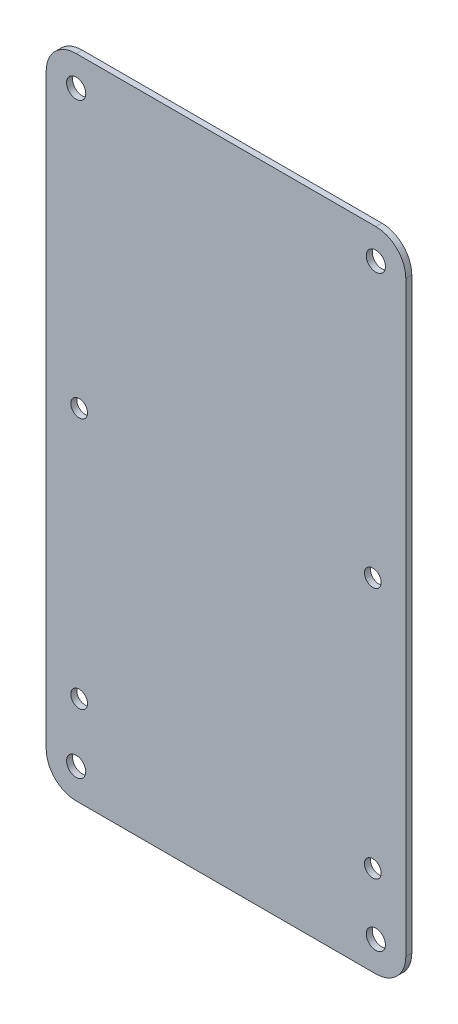
ISO-10303-21;
HEADER;
FILE_DESCRIPTION(('STEP AP214'),'2;1');
FILE_NAME('part.step','',(''),(''),'','','');
FILE_SCHEMA(('AUTOMOTIVE_DESIGN { 1 0 10303 214 1 1 1 1 }'));
ENDSEC;
DATA;
#1=APPLICATION_CONTEXT('core data for automotive mechanical design processes');
#2=APPLICATION_PROTOCOL_DEFINITION('international standard','automotive_design',2000,#1);
#3=PRODUCT_CONTEXT('',#1,'mechanical');
#4=PRODUCT('Part','Part','',(#3));
#5=PRODUCT_RELATED_PRODUCT_CATEGORY('part','',(#4));
#6=PRODUCT_DEFINITION_FORMATION('','',#4);
#7=PRODUCT_DEFINITION_CONTEXT('part definition',#1,'design');
#8=PRODUCT_DEFINITION('design','',#6,#7);
#9=PRODUCT_DEFINITION_SHAPE('','',#8);
#10=(LENGTH_UNIT() NAMED_UNIT(*) SI_UNIT(.MILLI.,.METRE.));
#11=(NAMED_UNIT(*) PLANE_ANGLE_UNIT() SI_UNIT($,.RADIAN.));
#12=(NAMED_UNIT(*) SI_UNIT($,.STERADIAN.) SOLID_ANGLE_UNIT());
#13=UNCERTAINTY_MEASURE_WITH_UNIT(LENGTH_MEASURE(1.E-05),#10,'distance_accuracy_value','');
#14=(GEOMETRIC_REPRESENTATION_CONTEXT(3) GLOBAL_UNCERTAINTY_ASSIGNED_CONTEXT((#13)) GLOBAL_UNIT_ASSIGNED_CONTEXT((#10,
#11,#12)) REPRESENTATION_CONTEXT('',''));
#15=CARTESIAN_POINT('',(0.,0.,0.));
#16=DIRECTION('',(0.,0.,1.));
#17=DIRECTION('',(1.,0.,0.));
#18=AXIS2_PLACEMENT_3D('',#15,#16,#17);
#19=CARTESIAN_POINT('',(30.,54.,1.));
#20=DIRECTION('',(-1.,0.,0.));
#21=DIRECTION('',(0.,-1.,0.));
#22=AXIS2_PLACEMENT_3D('',#19,#20,#21);
#23=PLANE('',#22);
#24=DIRECTION('',(0.,1.,0.));
#25=VECTOR('',#24,1.);
#26=CARTESIAN_POINT('',(30.,54.,1.));
#27=LINE('',#26,#25);
#28=CARTESIAN_POINT('',(30.,-49.,1.));
#29=VERTEX_POINT('',#28);
#30=CARTESIAN_POINT('',(30.,49.,1.));
#31=VERTEX_POINT('',#30);
#32=EDGE_CURVE('E128',#29,#31,#27,.T.);
#33=ORIENTED_EDGE('',*,*,#32,.F.);
#34=DIRECTION('',(0.,0.,-1.));
#35=VECTOR('',#34,1.);
#36=CARTESIAN_POINT('',(30.,-49.,1.));
#37=LINE('',#36,#35);
#38=CARTESIAN_POINT('',(30.,-49.,0.));
#39=VERTEX_POINT('',#38);
#40=EDGE_CURVE('E169',#29,#39,#37,.T.);
#41=ORIENTED_EDGE('',*,*,#40,.T.);
#42=DIRECTION('',(0.,1.,0.));
#43=VECTOR('',#42,1.);
#44=CARTESIAN_POINT('',(30.,54.,0.));
#45=LINE('',#44,#43);
#46=CARTESIAN_POINT('',(30.,49.,0.));
#47=VERTEX_POINT('',#46);
#48=EDGE_CURVE('E140',#39,#47,#45,.T.);
#49=ORIENTED_EDGE('',*,*,#48,.T.);
#50=DIRECTION('',(0.,0.,-1.));
#51=VECTOR('',#50,1.);
#52=CARTESIAN_POINT('',(30.,49.,1.));
#53=LINE('',#52,#51);
#54=EDGE_CURVE('E167',#47,#31,#53,.F.);
#55=ORIENTED_EDGE('',*,*,#54,.T.);
#56=EDGE_LOOP('',(#33,#41,#49,#55));
#57=FACE_BOUND('',#56,.T.);
#58=ADVANCED_FACE('F37',(#57),#23,.F.);
#59=CARTESIAN_POINT('',(-30.,54.,1.));
#60=DIRECTION('',(0.,-1.,0.));
#61=DIRECTION('',(1.,0.,0.));
#62=AXIS2_PLACEMENT_3D('',#59,#60,#61);
#63=PLANE('',#62);
#64=DIRECTION('',(-1.,0.,0.));
#65=VECTOR('',#64,1.);
#66=CARTESIAN_POINT('',(-30.,54.,0.));
#67=LINE('',#66,#65);
#68=CARTESIAN_POINT('',(25.,54.,0.));
#69=VERTEX_POINT('',#68);
#70=CARTESIAN_POINT('',(-25.,54.,0.));
#71=VERTEX_POINT('',#70);
#72=EDGE_CURVE('E133',#69,#71,#67,.T.);
#73=ORIENTED_EDGE('',*,*,#72,.T.);
#74=DIRECTION('',(0.,0.,-1.));
#75=VECTOR('',#74,1.);
#76=CARTESIAN_POINT('',(-25.,54.,1.));
#77=LINE('',#76,#75);
#78=CARTESIAN_POINT('',(-25.,54.,1.));
#79=VERTEX_POINT('',#78);
#80=EDGE_CURVE('E11',#71,#79,#77,.F.);
#81=ORIENTED_EDGE('',*,*,#80,.T.);
#82=DIRECTION('',(-1.,0.,0.));
#83=VECTOR('',#82,1.);
#84=CARTESIAN_POINT('',(-30.,54.,1.));
#85=LINE('',#84,#83);
#86=CARTESIAN_POINT('',(25.,54.,1.));
#87=VERTEX_POINT('',#86);
#88=EDGE_CURVE('E131',#87,#79,#85,.T.);
#89=ORIENTED_EDGE('',*,*,#88,.F.);
#90=DIRECTION('',(0.,0.,-1.));
#91=VECTOR('',#90,1.);
#92=CARTESIAN_POINT('',(25.,54.,1.));
#93=LINE('',#92,#91);
#94=EDGE_CURVE('E45',#87,#69,#93,.T.);
#95=ORIENTED_EDGE('',*,*,#94,.T.);
#96=EDGE_LOOP('',(#73,#81,#89,#95));
#97=FACE_BOUND('',#96,.T.);
#98=ADVANCED_FACE('F174',(#97),#63,.F.);
#99=CARTESIAN_POINT('',(-30.,54.,1.));
#100=DIRECTION('',(1.,0.,0.));
#101=DIRECTION('',(0.,1.,0.));
#102=AXIS2_PLACEMENT_3D('',#99,#100,#101);
#103=PLANE('',#102);
#104=DIRECTION('',(0.,-1.,0.));
#105=VECTOR('',#104,1.);
#106=CARTESIAN_POINT('',(-30.,54.,0.));
#107=LINE('',#106,#105);
#108=CARTESIAN_POINT('',(-30.,49.,0.));
#109=VERTEX_POINT('',#108);
#110=CARTESIAN_POINT('',(-30.,-49.,0.));
#111=VERTEX_POINT('',#110);
#112=EDGE_CURVE('E129',#109,#111,#107,.T.);
#113=ORIENTED_EDGE('',*,*,#112,.T.);
#114=DIRECTION('',(0.,0.,-1.));
#115=VECTOR('',#114,1.);
#116=CARTESIAN_POINT('',(-30.,-49.,1.));
#117=LINE('',#116,#115);
#118=CARTESIAN_POINT('',(-30.,-49.,1.));
#119=VERTEX_POINT('',#118);
#120=EDGE_CURVE('E107',#111,#119,#117,.F.);
#121=ORIENTED_EDGE('',*,*,#120,.T.);
#122=DIRECTION('',(0.,-1.,0.));
#123=VECTOR('',#122,1.);
#124=CARTESIAN_POINT('',(-30.,54.,1.));
#125=LINE('',#124,#123);
#126=CARTESIAN_POINT('',(-30.,49.,1.));
#127=VERTEX_POINT('',#126);
#128=EDGE_CURVE('E180',#127,#119,#125,.T.);
#129=ORIENTED_EDGE('',*,*,#128,.F.);
#130=DIRECTION('',(0.,0.,-1.));
#131=VECTOR('',#130,1.);
#132=CARTESIAN_POINT('',(-30.,49.,1.));
#133=LINE('',#132,#131);
#134=EDGE_CURVE('E112',#127,#109,#133,.T.);
#135=ORIENTED_EDGE('',*,*,#134,.T.);
#136=EDGE_LOOP('',(#113,#121,#129,#135));
#137=FACE_BOUND('',#136,.T.);
#138=ADVANCED_FACE('F249',(#137),#103,.F.);
#139=CARTESIAN_POINT('',(-30.,-54.,1.));
#140=DIRECTION('',(0.,1.,0.));
#141=DIRECTION('',(0.,0.,1.));
#142=AXIS2_PLACEMENT_3D('',#139,#140,#141);
#143=PLANE('',#142);
#144=DIRECTION('',(1.,0.,0.));
#145=VECTOR('',#144,1.);
#146=CARTESIAN_POINT('',(-30.,-54.,1.));
#147=LINE('',#146,#145);
#148=CARTESIAN_POINT('',(-25.,-54.,1.));
#149=VERTEX_POINT('',#148);
#150=CARTESIAN_POINT('',(25.,-54.,1.));
#151=VERTEX_POINT('',#150);
#152=EDGE_CURVE('E122',#149,#151,#147,.T.);
#153=ORIENTED_EDGE('',*,*,#152,.F.);
#154=DIRECTION('',(0.,0.,-1.));
#155=VECTOR('',#154,1.);
#156=CARTESIAN_POINT('',(-25.,-54.,1.));
#157=LINE('',#156,#155);
#158=CARTESIAN_POINT('',(-25.,-54.,0.));
#159=VERTEX_POINT('',#158);
#160=EDGE_CURVE('E106',#149,#159,#157,.T.);
#161=ORIENTED_EDGE('',*,*,#160,.T.);
#162=DIRECTION('',(1.,0.,0.));
#163=VECTOR('',#162,1.);
#164=CARTESIAN_POINT('',(-30.,-54.,0.));
#165=LINE('',#164,#163);
#166=CARTESIAN_POINT('',(25.,-54.,0.));
#167=VERTEX_POINT('',#166);
#168=EDGE_CURVE('E119',#159,#167,#165,.T.);
#169=ORIENTED_EDGE('',*,*,#168,.T.);
#170=DIRECTION('',(0.,0.,-1.));
#171=VECTOR('',#170,1.);
#172=CARTESIAN_POINT('',(25.,-54.,1.));
#173=LINE('',#172,#171);
#174=EDGE_CURVE('E124',#167,#151,#173,.F.);
#175=ORIENTED_EDGE('',*,*,#174,.T.);
#176=EDGE_LOOP('',(#153,#161,#169,#175));
#177=FACE_BOUND('',#176,.T.);
#178=ADVANCED_FACE('F118',(#177),#143,.F.);
#179=CARTESIAN_POINT('',(0.,0.,1.));
#180=DIRECTION('',(0.,0.,1.));
#181=DIRECTION('',(1.,0.,0.));
#182=AXIS2_PLACEMENT_3D('',#179,#180,#181);
#183=PLANE('',#182);
#184=CARTESIAN_POINT('',(-25.,49.,1.));
#185=DIRECTION('',(0.,0.,1.));
#186=DIRECTION('',(1.,0.,0.));
#187=AXIS2_PLACEMENT_3D('',#184,#185,#186);
#188=CIRCLE('',#187,1.6);
#189=CARTESIAN_POINT('',(-23.4,49.,1.));
#190=VERTEX_POINT('',#189);
#191=EDGE_CURVE('E213',#190,#190,#188,.T.);
#192=ORIENTED_EDGE('',*,*,#191,.F.);
#193=EDGE_LOOP('',(#192));
#194=FACE_BOUND('',#193,.T.);
#195=CARTESIAN_POINT('',(-25.,-49.,1.));
#196=DIRECTION('',(0.,0.,1.));
#197=DIRECTION('',(1.,0.,0.));
#198=AXIS2_PLACEMENT_3D('',#195,#196,#197);
#199=CIRCLE('',#198,1.6);
#200=CARTESIAN_POINT('',(-23.4,-49.,1.));
#201=VERTEX_POINT('',#200);
#202=EDGE_CURVE('E207',#201,#201,#199,.T.);
#203=ORIENTED_EDGE('',*,*,#202,.F.);
#204=EDGE_LOOP('',(#203));
#205=FACE_BOUND('',#204,.T.);
#206=CARTESIAN_POINT('',(25.,-49.,1.));
#207=DIRECTION('',(0.,0.,1.));
#208=DIRECTION('',(1.,0.,0.));
#209=AXIS2_PLACEMENT_3D('',#206,#207,#208);
#210=CIRCLE('',#209,1.6);
#211=CARTESIAN_POINT('',(26.6,-49.,1.));
#212=VERTEX_POINT('',#211);
#213=EDGE_CURVE('E201',#212,#212,#210,.T.);
#214=ORIENTED_EDGE('',*,*,#213,.F.);
#215=EDGE_LOOP('',(#214));
#216=FACE_BOUND('',#215,.T.);
#217=CARTESIAN_POINT('',(25.,49.,1.));
#218=DIRECTION('',(0.,0.,1.));
#219=DIRECTION('',(1.,0.,0.));
#220=AXIS2_PLACEMENT_3D('',#217,#218,#219);
#221=CIRCLE('',#220,1.6);
#222=CARTESIAN_POINT('',(26.6,49.,1.));
#223=VERTEX_POINT('',#222);
#224=EDGE_CURVE('E195',#223,#223,#221,.T.);
#225=ORIENTED_EDGE('',*,*,#224,.F.);
#226=EDGE_LOOP('',(#225));
#227=FACE_BOUND('',#226,.T.);
#228=CARTESIAN_POINT('',(-24.5,-39.,1.));
#229=DIRECTION('',(0.,0.,1.));
#230=DIRECTION('',(1.,0.,0.));
#231=AXIS2_PLACEMENT_3D('',#228,#229,#230);
#232=CIRCLE('',#231,1.4);
#233=CARTESIAN_POINT('',(-23.1,-39.,1.));
#234=VERTEX_POINT('',#233);
#235=EDGE_CURVE('E146',#234,#234,#232,.T.);
#236=ORIENTED_EDGE('',*,*,#235,.F.);
#237=EDGE_LOOP('',(#236));
#238=FACE_BOUND('',#237,.T.);
#239=CARTESIAN_POINT('',(24.5,3.00000000000001,1.));
#240=DIRECTION('',(0.,0.,1.));
#241=DIRECTION('',(1.,0.,0.));
#242=AXIS2_PLACEMENT_3D('',#239,#240,#241);
#243=CIRCLE('',#242,1.4);
#244=CARTESIAN_POINT('',(25.9,3.00000000000001,1.));
#245=VERTEX_POINT('',#244);
#246=EDGE_CURVE('E189',#245,#245,#243,.T.);
#247=ORIENTED_EDGE('',*,*,#246,.F.);
#248=EDGE_LOOP('',(#247));
#249=FACE_BOUND('',#248,.T.);
#250=CARTESIAN_POINT('',(24.5,-39.,1.));
#251=DIRECTION('',(0.,0.,1.));
#252=DIRECTION('',(1.,0.,0.));
#253=AXIS2_PLACEMENT_3D('',#250,#251,#252);
#254=CIRCLE('',#253,1.4);
#255=CARTESIAN_POINT('',(25.9,-39.,1.));
#256=VERTEX_POINT('',#255);
#257=EDGE_CURVE('E186',#256,#256,#254,.T.);
#258=ORIENTED_EDGE('',*,*,#257,.F.);
#259=EDGE_LOOP('',(#258));
#260=FACE_BOUND('',#259,.T.);
#261=CARTESIAN_POINT('',(-24.5,3.,1.));
#262=DIRECTION('',(0.,0.,1.));
#263=DIRECTION('',(1.,0.,0.));
#264=AXIS2_PLACEMENT_3D('',#261,#262,#263);
#265=CIRCLE('',#264,1.4);
#266=CARTESIAN_POINT('',(-23.1,3.,1.));
#267=VERTEX_POINT('',#266);
#268=EDGE_CURVE('E141',#267,#267,#265,.T.);
#269=ORIENTED_EDGE('',*,*,#268,.F.);
#270=EDGE_LOOP('',(#269));
#271=FACE_BOUND('',#270,.T.);
#272=ORIENTED_EDGE('',*,*,#128,.T.);
#273=CARTESIAN_POINT('',(-25.,-49.,1.));
#274=DIRECTION('',(0.,0.,1.));
#275=DIRECTION('',(1.,0.,0.));
#276=AXIS2_PLACEMENT_3D('',#273,#274,#275);
#277=CIRCLE('',#276,5.);
#278=EDGE_CURVE('E165',#119,#149,#277,.T.);
#279=ORIENTED_EDGE('',*,*,#278,.T.);
#280=ORIENTED_EDGE('',*,*,#152,.T.);
#281=CARTESIAN_POINT('',(25.,-49.,1.));
#282=DIRECTION('',(0.,0.,1.));
#283=DIRECTION('',(1.,0.,0.));
#284=AXIS2_PLACEMENT_3D('',#281,#282,#283);
#285=CIRCLE('',#284,5.);
#286=EDGE_CURVE('E163',#151,#29,#285,.T.);
#287=ORIENTED_EDGE('',*,*,#286,.T.);
#288=ORIENTED_EDGE('',*,*,#32,.T.);
#289=CARTESIAN_POINT('',(25.,49.,1.));
#290=DIRECTION('',(0.,0.,1.));
#291=DIRECTION('',(1.,0.,0.));
#292=AXIS2_PLACEMENT_3D('',#289,#290,#291);
#293=CIRCLE('',#292,5.);
#294=EDGE_CURVE('E57',#31,#87,#293,.T.);
#295=ORIENTED_EDGE('',*,*,#294,.T.);
#296=ORIENTED_EDGE('',*,*,#88,.T.);
#297=CARTESIAN_POINT('',(-25.,49.,1.));
#298=DIRECTION('',(0.,0.,1.));
#299=DIRECTION('',(1.,0.,0.));
#300=AXIS2_PLACEMENT_3D('',#297,#298,#299);
#301=CIRCLE('',#300,5.);
#302=EDGE_CURVE('E161',#79,#127,#301,.T.);
#303=ORIENTED_EDGE('',*,*,#302,.T.);
#304=EDGE_LOOP('',(#272,#279,#280,#287,#288,#295,#296,#303));
#305=FACE_BOUND('',#304,.T.);
#306=ADVANCED_FACE('F228',(#194,#205,#216,#227,#238,#249,#260,#271,#305),#183,.T.);
#307=CARTESIAN_POINT('',(0.,0.,0.));
#308=DIRECTION('',(0.,0.,1.));
#309=DIRECTION('',(1.,0.,0.));
#310=AXIS2_PLACEMENT_3D('',#307,#308,#309);
#311=PLANE('',#310);
#312=CARTESIAN_POINT('',(-25.,49.,0.));
#313=DIRECTION('',(0.,0.,1.));
#314=DIRECTION('',(1.,0.,0.));
#315=AXIS2_PLACEMENT_3D('',#312,#313,#314);
#316=CIRCLE('',#315,1.6);
#317=CARTESIAN_POINT('',(-23.4,49.,0.));
#318=VERTEX_POINT('',#317);
#319=EDGE_CURVE('E198',#318,#318,#316,.T.);
#320=ORIENTED_EDGE('',*,*,#319,.T.);
#321=EDGE_LOOP('',(#320));
#322=FACE_BOUND('',#321,.T.);
#323=CARTESIAN_POINT('',(-25.,-49.,0.));
#324=DIRECTION('',(0.,0.,1.));
#325=DIRECTION('',(1.,0.,0.));
#326=AXIS2_PLACEMENT_3D('',#323,#324,#325);
#327=CIRCLE('',#326,1.6);
#328=CARTESIAN_POINT('',(-23.4,-49.,0.));
#329=VERTEX_POINT('',#328);
#330=EDGE_CURVE('E210',#329,#329,#327,.T.);
#331=ORIENTED_EDGE('',*,*,#330,.T.);
#332=EDGE_LOOP('',(#331));
#333=FACE_BOUND('',#332,.T.);
#334=CARTESIAN_POINT('',(25.,-49.,0.));
#335=DIRECTION('',(0.,0.,1.));
#336=DIRECTION('',(1.,0.,0.));
#337=AXIS2_PLACEMENT_3D('',#334,#335,#336);
#338=CIRCLE('',#337,1.6);
#339=CARTESIAN_POINT('',(26.6,-49.,0.));
#340=VERTEX_POINT('',#339);
#341=EDGE_CURVE('E204',#340,#340,#338,.T.);
#342=ORIENTED_EDGE('',*,*,#341,.T.);
#343=EDGE_LOOP('',(#342));
#344=FACE_BOUND('',#343,.T.);
#345=CARTESIAN_POINT('',(25.,49.,0.));
#346=DIRECTION('',(0.,0.,1.));
#347=DIRECTION('',(1.,0.,0.));
#348=AXIS2_PLACEMENT_3D('',#345,#346,#347);
#349=CIRCLE('',#348,1.6);
#350=CARTESIAN_POINT('',(26.6,49.,0.));
#351=VERTEX_POINT('',#350);
#352=EDGE_CURVE('E190',#351,#351,#349,.T.);
#353=ORIENTED_EDGE('',*,*,#352,.T.);
#354=EDGE_LOOP('',(#353));
#355=FACE_BOUND('',#354,.T.);
#356=CARTESIAN_POINT('',(-24.5,-39.,0.));
#357=DIRECTION('',(0.,0.,1.));
#358=DIRECTION('',(1.,0.,0.));
#359=AXIS2_PLACEMENT_3D('',#356,#357,#358);
#360=CIRCLE('',#359,1.4);
#361=CARTESIAN_POINT('',(-23.1,-39.,0.));
#362=VERTEX_POINT('',#361);
#363=EDGE_CURVE('E149',#362,#362,#360,.T.);
#364=ORIENTED_EDGE('',*,*,#363,.T.);
#365=EDGE_LOOP('',(#364));
#366=FACE_BOUND('',#365,.T.);
#367=CARTESIAN_POINT('',(24.5,3.00000000000001,0.));
#368=DIRECTION('',(0.,0.,1.));
#369=DIRECTION('',(1.,0.,0.));
#370=AXIS2_PLACEMENT_3D('',#367,#368,#369);
#371=CIRCLE('',#370,1.4);
#372=CARTESIAN_POINT('',(25.9,3.00000000000001,0.));
#373=VERTEX_POINT('',#372);
#374=EDGE_CURVE('E145',#373,#373,#371,.T.);
#375=ORIENTED_EDGE('',*,*,#374,.T.);
#376=EDGE_LOOP('',(#375));
#377=FACE_BOUND('',#376,.T.);
#378=CARTESIAN_POINT('',(24.5,-39.,0.));
#379=DIRECTION('',(0.,0.,1.));
#380=DIRECTION('',(1.,0.,0.));
#381=AXIS2_PLACEMENT_3D('',#378,#379,#380);
#382=CIRCLE('',#381,1.4);
#383=CARTESIAN_POINT('',(25.9,-39.,0.));
#384=VERTEX_POINT('',#383);
#385=EDGE_CURVE('E142',#384,#384,#382,.T.);
#386=ORIENTED_EDGE('',*,*,#385,.T.);
#387=EDGE_LOOP('',(#386));
#388=FACE_BOUND('',#387,.T.);
#389=CARTESIAN_POINT('',(-24.5,3.,0.));
#390=DIRECTION('',(0.,0.,1.));
#391=DIRECTION('',(1.,0.,0.));
#392=AXIS2_PLACEMENT_3D('',#389,#390,#391);
#393=CIRCLE('',#392,1.4);
#394=CARTESIAN_POINT('',(-23.1,3.,0.));
#395=VERTEX_POINT('',#394);
#396=EDGE_CURVE('E137',#395,#395,#393,.T.);
#397=ORIENTED_EDGE('',*,*,#396,.T.);
#398=EDGE_LOOP('',(#397));
#399=FACE_BOUND('',#398,.T.);
#400=ORIENTED_EDGE('',*,*,#168,.F.);
#401=CARTESIAN_POINT('',(-25.,-49.,0.));
#402=DIRECTION('',(0.,0.,1.));
#403=DIRECTION('',(1.,0.,0.));
#404=AXIS2_PLACEMENT_3D('',#401,#402,#403);
#405=CIRCLE('',#404,5.);
#406=EDGE_CURVE('E102',#159,#111,#405,.F.);
#407=ORIENTED_EDGE('',*,*,#406,.T.);
#408=ORIENTED_EDGE('',*,*,#112,.F.);
#409=CARTESIAN_POINT('',(-25.,49.,0.));
#410=DIRECTION('',(0.,0.,1.));
#411=DIRECTION('',(1.,0.,0.));
#412=AXIS2_PLACEMENT_3D('',#409,#410,#411);
#413=CIRCLE('',#412,5.);
#414=EDGE_CURVE('E154',#109,#71,#413,.F.);
#415=ORIENTED_EDGE('',*,*,#414,.T.);
#416=ORIENTED_EDGE('',*,*,#72,.F.);
#417=CARTESIAN_POINT('',(25.,49.,0.));
#418=DIRECTION('',(0.,0.,1.));
#419=DIRECTION('',(1.,0.,0.));
#420=AXIS2_PLACEMENT_3D('',#417,#418,#419);
#421=CIRCLE('',#420,5.);
#422=EDGE_CURVE('E123',#69,#47,#421,.F.);
#423=ORIENTED_EDGE('',*,*,#422,.T.);
#424=ORIENTED_EDGE('',*,*,#48,.F.);
#425=CARTESIAN_POINT('',(25.,-49.,0.));
#426=DIRECTION('',(0.,0.,1.));
#427=DIRECTION('',(1.,0.,0.));
#428=AXIS2_PLACEMENT_3D('',#425,#426,#427);
#429=CIRCLE('',#428,5.);
#430=EDGE_CURVE('E113',#39,#167,#429,.F.);
#431=ORIENTED_EDGE('',*,*,#430,.T.);
#432=EDGE_LOOP('',(#400,#407,#408,#415,#416,#423,#424,#431));
#433=FACE_BOUND('',#432,.T.);
#434=ADVANCED_FACE('F126',(#322,#333,#344,#355,#366,#377,#388,#399,#433),#311,.F.);
#435=CARTESIAN_POINT('',(-24.5,3.,-9.));
#436=DIRECTION('',(0.,0.,1.));
#437=DIRECTION('',(1.,0.,0.));
#438=AXIS2_PLACEMENT_3D('',#435,#436,#437);
#439=CYLINDRICAL_SURFACE('',#438,1.4);
#440=ORIENTED_EDGE('',*,*,#268,.T.);
#441=EDGE_LOOP('',(#440));
#442=FACE_BOUND('',#441,.T.);
#443=ORIENTED_EDGE('',*,*,#396,.F.);
#444=EDGE_LOOP('',(#443));
#445=FACE_BOUND('',#444,.T.);
#446=ADVANCED_FACE('F351',(#442,#445),#439,.F.);
#447=CARTESIAN_POINT('',(24.5,-39.,-9.));
#448=DIRECTION('',(0.,0.,1.));
#449=DIRECTION('',(1.,0.,0.));
#450=AXIS2_PLACEMENT_3D('',#447,#448,#449);
#451=CYLINDRICAL_SURFACE('',#450,1.4);
#452=ORIENTED_EDGE('',*,*,#257,.T.);
#453=EDGE_LOOP('',(#452));
#454=FACE_BOUND('',#453,.T.);
#455=ORIENTED_EDGE('',*,*,#385,.F.);
#456=EDGE_LOOP('',(#455));
#457=FACE_BOUND('',#456,.T.);
#458=ADVANCED_FACE('F342',(#454,#457),#451,.F.);
#459=CARTESIAN_POINT('',(24.5,3.00000000000001,-9.));
#460=DIRECTION('',(0.,0.,1.));
#461=DIRECTION('',(1.,0.,0.));
#462=AXIS2_PLACEMENT_3D('',#459,#460,#461);
#463=CYLINDRICAL_SURFACE('',#462,1.4);
#464=ORIENTED_EDGE('',*,*,#246,.T.);
#465=EDGE_LOOP('',(#464));
#466=FACE_BOUND('',#465,.T.);
#467=ORIENTED_EDGE('',*,*,#374,.F.);
#468=EDGE_LOOP('',(#467));
#469=FACE_BOUND('',#468,.T.);
#470=ADVANCED_FACE('F333',(#466,#469),#463,.F.);
#471=CARTESIAN_POINT('',(-24.5,-39.,-9.));
#472=DIRECTION('',(0.,0.,1.));
#473=DIRECTION('',(1.,0.,0.));
#474=AXIS2_PLACEMENT_3D('',#471,#472,#473);
#475=CYLINDRICAL_SURFACE('',#474,1.4);
#476=ORIENTED_EDGE('',*,*,#235,.T.);
#477=EDGE_LOOP('',(#476));
#478=FACE_BOUND('',#477,.T.);
#479=ORIENTED_EDGE('',*,*,#363,.F.);
#480=EDGE_LOOP('',(#479));
#481=FACE_BOUND('',#480,.T.);
#482=ADVANCED_FACE('F324',(#478,#481),#475,.F.);
#483=CARTESIAN_POINT('',(25.,49.,0.));
#484=DIRECTION('',(0.,0.,1.));
#485=DIRECTION('',(1.,0.,0.));
#486=AXIS2_PLACEMENT_3D('',#483,#484,#485);
#487=CYLINDRICAL_SURFACE('',#486,1.6);
#488=ORIENTED_EDGE('',*,*,#352,.F.);
#489=EDGE_LOOP('',(#488));
#490=FACE_BOUND('',#489,.T.);
#491=ORIENTED_EDGE('',*,*,#224,.T.);
#492=EDGE_LOOP('',(#491));
#493=FACE_BOUND('',#492,.T.);
#494=ADVANCED_FACE('F315',(#490,#493),#487,.F.);
#495=CARTESIAN_POINT('',(25.,-49.,0.));
#496=DIRECTION('',(0.,0.,1.));
#497=DIRECTION('',(1.,0.,0.));
#498=AXIS2_PLACEMENT_3D('',#495,#496,#497);
#499=CYLINDRICAL_SURFACE('',#498,1.6);
#500=ORIENTED_EDGE('',*,*,#341,.F.);
#501=EDGE_LOOP('',(#500));
#502=FACE_BOUND('',#501,.T.);
#503=ORIENTED_EDGE('',*,*,#213,.T.);
#504=EDGE_LOOP('',(#503));
#505=FACE_BOUND('',#504,.T.);
#506=ADVANCED_FACE('F306',(#502,#505),#499,.F.);
#507=CARTESIAN_POINT('',(-25.,-49.,0.));
#508=DIRECTION('',(0.,0.,1.));
#509=DIRECTION('',(1.,0.,0.));
#510=AXIS2_PLACEMENT_3D('',#507,#508,#509);
#511=CYLINDRICAL_SURFACE('',#510,1.6);
#512=ORIENTED_EDGE('',*,*,#330,.F.);
#513=EDGE_LOOP('',(#512));
#514=FACE_BOUND('',#513,.T.);
#515=ORIENTED_EDGE('',*,*,#202,.T.);
#516=EDGE_LOOP('',(#515));
#517=FACE_BOUND('',#516,.T.);
#518=ADVANCED_FACE('F224',(#514,#517),#511,.F.);
#519=CARTESIAN_POINT('',(-25.,49.,0.));
#520=DIRECTION('',(0.,0.,1.));
#521=DIRECTION('',(1.,0.,0.));
#522=AXIS2_PLACEMENT_3D('',#519,#520,#521);
#523=CYLINDRICAL_SURFACE('',#522,1.6);
#524=ORIENTED_EDGE('',*,*,#319,.F.);
#525=EDGE_LOOP('',(#524));
#526=FACE_BOUND('',#525,.T.);
#527=ORIENTED_EDGE('',*,*,#191,.T.);
#528=EDGE_LOOP('',(#527));
#529=FACE_BOUND('',#528,.T.);
#530=ADVANCED_FACE('F221',(#526,#529),#523,.F.);
#531=CARTESIAN_POINT('',(-25.,-49.,1.));
#532=DIRECTION('',(0.,0.,-1.));
#533=DIRECTION('',(-1.,0.,0.));
#534=AXIS2_PLACEMENT_3D('',#531,#532,#533);
#535=CYLINDRICAL_SURFACE('',#534,5.);
#536=ORIENTED_EDGE('',*,*,#278,.F.);
#537=ORIENTED_EDGE('',*,*,#120,.F.);
#538=ORIENTED_EDGE('',*,*,#406,.F.);
#539=ORIENTED_EDGE('',*,*,#160,.F.);
#540=EDGE_LOOP('',(#536,#537,#538,#539));
#541=FACE_BOUND('',#540,.T.);
#542=ADVANCED_FACE('F105',(#541),#535,.T.);
#543=CARTESIAN_POINT('',(25.,-49.,1.));
#544=DIRECTION('',(0.,0.,-1.));
#545=DIRECTION('',(-1.,0.,0.));
#546=AXIS2_PLACEMENT_3D('',#543,#544,#545);
#547=CYLINDRICAL_SURFACE('',#546,5.);
#548=ORIENTED_EDGE('',*,*,#286,.F.);
#549=ORIENTED_EDGE('',*,*,#174,.F.);
#550=ORIENTED_EDGE('',*,*,#430,.F.);
#551=ORIENTED_EDGE('',*,*,#40,.F.);
#552=EDGE_LOOP('',(#548,#549,#550,#551));
#553=FACE_BOUND('',#552,.T.);
#554=ADVANCED_FACE('F253',(#553),#547,.T.);
#555=CARTESIAN_POINT('',(-25.,49.,1.));
#556=DIRECTION('',(0.,0.,-1.));
#557=DIRECTION('',(-1.,0.,0.));
#558=AXIS2_PLACEMENT_3D('',#555,#556,#557);
#559=CYLINDRICAL_SURFACE('',#558,5.);
#560=ORIENTED_EDGE('',*,*,#302,.F.);
#561=ORIENTED_EDGE('',*,*,#80,.F.);
#562=ORIENTED_EDGE('',*,*,#414,.F.);
#563=ORIENTED_EDGE('',*,*,#134,.F.);
#564=EDGE_LOOP('',(#560,#561,#562,#563));
#565=FACE_BOUND('',#564,.T.);
#566=ADVANCED_FACE('F251',(#565),#559,.T.);
#567=CARTESIAN_POINT('',(25.,49.,1.));
#568=DIRECTION('',(0.,0.,-1.));
#569=DIRECTION('',(-1.,0.,0.));
#570=AXIS2_PLACEMENT_3D('',#567,#568,#569);
#571=CYLINDRICAL_SURFACE('',#570,5.);
#572=ORIENTED_EDGE('',*,*,#294,.F.);
#573=ORIENTED_EDGE('',*,*,#54,.F.);
#574=ORIENTED_EDGE('',*,*,#422,.F.);
#575=ORIENTED_EDGE('',*,*,#94,.F.);
#576=EDGE_LOOP('',(#572,#573,#574,#575));
#577=FACE_BOUND('',#576,.T.);
#578=ADVANCED_FACE('F39',(#577),#571,.T.);
#579=CLOSED_SHELL('',(#58,#98,#138,#178,#306,#434,#446,#458,#470,#482,#494,#506,#518,#530,#542,
#554,#566,#578));
#580=MANIFOLD_SOLID_BREP('B2',#579);
#581=ADVANCED_BREP_SHAPE_REPRESENTATION('',(#18,#580),#14);
#582=SHAPE_DEFINITION_REPRESENTATION(#9,#581);
ENDSEC;
END-ISO-10303-21;
